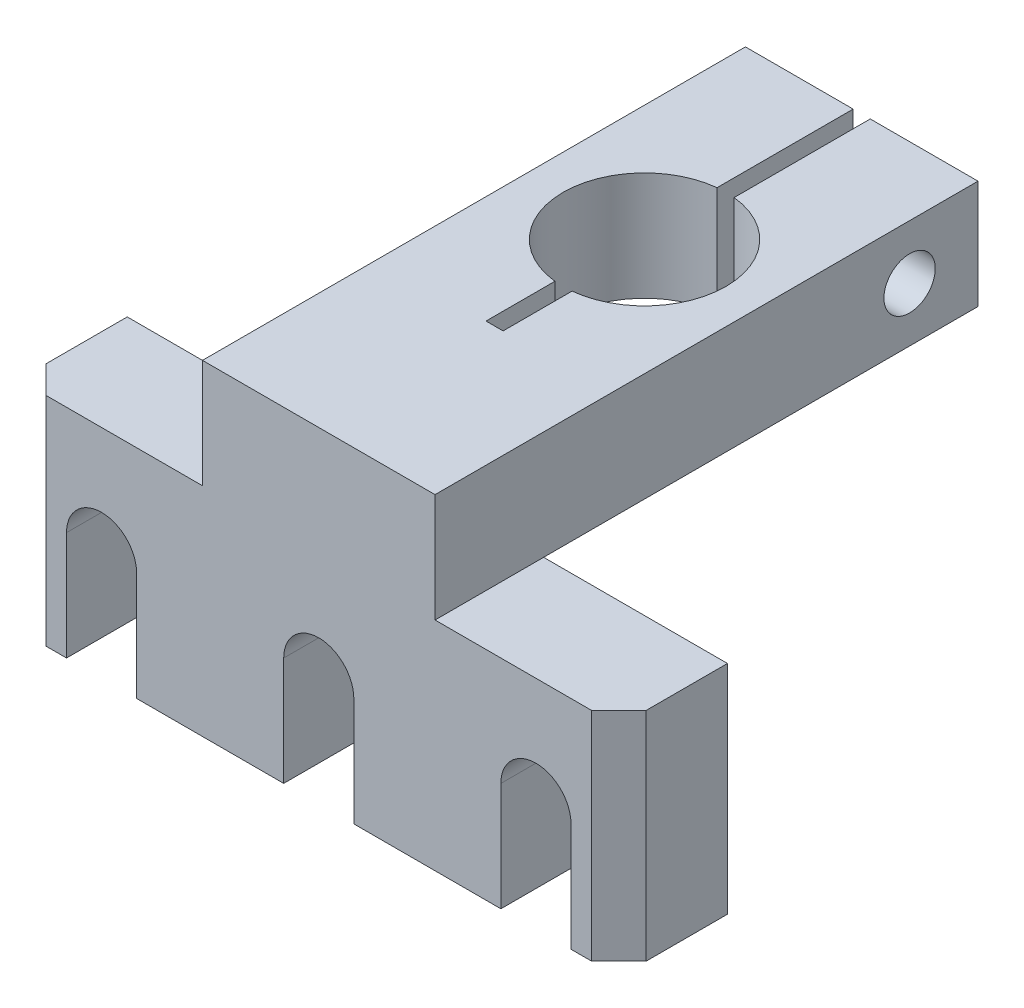
ISO-10303-21;
HEADER;
FILE_DESCRIPTION(('STEP AP214'),'2;1');
FILE_NAME('part.step','',(''),(''),'','','');
FILE_SCHEMA(('AUTOMOTIVE_DESIGN { 1 0 10303 214 1 1 1 1 }'));
ENDSEC;
DATA;
#1=APPLICATION_CONTEXT('core data for automotive mechanical design processes');
#2=APPLICATION_PROTOCOL_DEFINITION('international standard','automotive_design',2000,#1);
#3=PRODUCT_CONTEXT('',#1,'mechanical');
#4=PRODUCT('Part','Part','',(#3));
#5=PRODUCT_RELATED_PRODUCT_CATEGORY('part','',(#4));
#6=PRODUCT_DEFINITION_FORMATION('','',#4);
#7=PRODUCT_DEFINITION_CONTEXT('part definition',#1,'design');
#8=PRODUCT_DEFINITION('design','',#6,#7);
#9=PRODUCT_DEFINITION_SHAPE('','',#8);
#10=(LENGTH_UNIT() NAMED_UNIT(*) SI_UNIT(.MILLI.,.METRE.));
#11=(NAMED_UNIT(*) PLANE_ANGLE_UNIT() SI_UNIT($,.RADIAN.));
#12=(NAMED_UNIT(*) SI_UNIT($,.STERADIAN.) SOLID_ANGLE_UNIT());
#13=UNCERTAINTY_MEASURE_WITH_UNIT(LENGTH_MEASURE(1.E-05),#10,'distance_accuracy_value','');
#14=(GEOMETRIC_REPRESENTATION_CONTEXT(3) GLOBAL_UNCERTAINTY_ASSIGNED_CONTEXT((#13)) GLOBAL_UNIT_ASSIGNED_CONTEXT((#10,
#11,#12)) REPRESENTATION_CONTEXT('',''));
#15=CARTESIAN_POINT('',(0.,0.,0.));
#16=DIRECTION('',(0.,0.,1.));
#17=DIRECTION('',(1.,0.,0.));
#18=AXIS2_PLACEMENT_3D('',#15,#16,#17);
#19=CARTESIAN_POINT('',(18.05,19.050025,-3.93));
#20=DIRECTION('',(0.,0.,1.));
#21=DIRECTION('',(1.,0.,0.));
#22=AXIS2_PLACEMENT_3D('',#19,#20,#21);
#23=PLANE('',#22);
#24=DIRECTION('',(0.,1.,0.));
#25=VECTOR('',#24,1.);
#26=CARTESIAN_POINT('',(18.05,19.050025,-3.93));
#27=LINE('',#26,#25);
#28=CARTESIAN_POINT('',(18.05,19.05,-3.93));
#29=VERTEX_POINT('',#28);
#30=CARTESIAN_POINT('',(18.05,12.7,-3.93));
#31=VERTEX_POINT('',#30);
#32=EDGE_CURVE('E297',#29,#31,#27,.F.);
#33=ORIENTED_EDGE('',*,*,#32,.T.);
#34=DIRECTION('',(1.,0.,0.));
#35=VECTOR('',#34,1.);
#36=CARTESIAN_POINT('',(18.05,12.7,-3.93));
#37=LINE('',#36,#35);
#38=CARTESIAN_POINT('',(17.05,12.7,-3.93));
#39=VERTEX_POINT('',#38);
#40=EDGE_CURVE('E384',#39,#31,#37,.T.);
#41=ORIENTED_EDGE('',*,*,#40,.F.);
#42=DIRECTION('',(0.,1.,0.));
#43=VECTOR('',#42,1.);
#44=CARTESIAN_POINT('',(17.05,19.050025,-3.93));
#45=LINE('',#44,#43);
#46=CARTESIAN_POINT('',(17.05,19.05,-3.93));
#47=VERTEX_POINT('',#46);
#48=EDGE_CURVE('E291',#39,#47,#45,.T.);
#49=ORIENTED_EDGE('',*,*,#48,.T.);
#50=DIRECTION('',(1.,0.,0.));
#51=VECTOR('',#50,1.);
#52=CARTESIAN_POINT('',(18.05,19.05,-3.93));
#53=LINE('',#52,#51);
#54=EDGE_CURVE('E300',#29,#47,#53,.F.);
#55=ORIENTED_EDGE('',*,*,#54,.F.);
#56=EDGE_LOOP('',(#33,#41,#49,#55));
#57=FACE_BOUND('',#56,.T.);
#58=ADVANCED_FACE('F16',(#57),#23,.F.);
#59=CARTESIAN_POINT('',(35.100025,15.875,-21.4));
#60=DIRECTION('',(-1.,0.,0.));
#61=DIRECTION('',(0.,0.,1.));
#62=AXIS2_PLACEMENT_3D('',#59,#60,#61);
#63=CYLINDRICAL_SURFACE('',#62,1.5);
#64=CARTESIAN_POINT('',(10.75,15.875,-21.4));
#65=DIRECTION('',(-1.,0.,0.));
#66=DIRECTION('',(0.,0.,1.));
#67=AXIS2_PLACEMENT_3D('',#64,#65,#66);
#68=CIRCLE('',#67,1.5);
#69=CARTESIAN_POINT('',(10.75,15.875,-19.9));
#70=VERTEX_POINT('',#69);
#71=EDGE_CURVE('E377',#70,#70,#68,.T.);
#72=ORIENTED_EDGE('',*,*,#71,.T.);
#73=EDGE_LOOP('',(#72));
#74=FACE_BOUND('',#73,.T.);
#75=CARTESIAN_POINT('',(17.05,15.875,-21.4));
#76=DIRECTION('',(-1.,0.,0.));
#77=DIRECTION('',(0.,0.,1.));
#78=AXIS2_PLACEMENT_3D('',#75,#76,#77);
#79=CIRCLE('',#78,1.5);
#80=CARTESIAN_POINT('',(17.05,15.875,-19.9));
#81=VERTEX_POINT('',#80);
#82=EDGE_CURVE('E19',#81,#81,#79,.F.);
#83=ORIENTED_EDGE('',*,*,#82,.T.);
#84=EDGE_LOOP('',(#83));
#85=FACE_BOUND('',#84,.T.);
#86=ADVANCED_FACE('F980',(#74,#85),#63,.F.);
#87=CARTESIAN_POINT('',(17.55,19.050025,-12.7));
#88=DIRECTION('',(0.,-1.,0.));
#89=DIRECTION('',(0.,0.,-1.));
#90=AXIS2_PLACEMENT_3D('',#87,#88,#89);
#91=CYLINDRICAL_SURFACE('',#90,4.765);
#92=DIRECTION('',(0.,1.,0.));
#93=VECTOR('',#92,1.);
#94=CARTESIAN_POINT('',(18.05,19.050025,-17.4386944404551));
#95=LINE('',#94,#93);
#96=CARTESIAN_POINT('',(18.05,19.05,-17.4386944404551));
#97=VERTEX_POINT('',#96);
#98=CARTESIAN_POINT('',(18.05,12.7,-17.4386944404551));
#99=VERTEX_POINT('',#98);
#100=EDGE_CURVE('E231',#97,#99,#95,.F.);
#101=ORIENTED_EDGE('',*,*,#100,.T.);
#102=CARTESIAN_POINT('',(17.55,12.7,-12.7));
#103=DIRECTION('',(0.,-1.,0.));
#104=DIRECTION('',(0.,0.,-1.));
#105=AXIS2_PLACEMENT_3D('',#102,#103,#104);
#106=CIRCLE('',#105,4.765);
#107=CARTESIAN_POINT('',(18.05,12.7,-7.96130555954491));
#108=VERTEX_POINT('',#107);
#109=EDGE_CURVE('E222',#108,#99,#106,.F.);
#110=ORIENTED_EDGE('',*,*,#109,.F.);
#111=DIRECTION('',(0.,1.,0.));
#112=VECTOR('',#111,1.);
#113=CARTESIAN_POINT('',(18.05,19.050025,-7.96130555954491));
#114=LINE('',#113,#112);
#115=CARTESIAN_POINT('',(18.05,19.05,-7.96130555954491));
#116=VERTEX_POINT('',#115);
#117=EDGE_CURVE('E217',#108,#116,#114,.T.);
#118=ORIENTED_EDGE('',*,*,#117,.T.);
#119=CARTESIAN_POINT('',(17.55,19.05,-12.7));
#120=DIRECTION('',(0.,-1.,0.));
#121=DIRECTION('',(0.,0.,-1.));
#122=AXIS2_PLACEMENT_3D('',#119,#120,#121);
#123=CIRCLE('',#122,4.765);
#124=EDGE_CURVE('E234',#97,#116,#123,.T.);
#125=ORIENTED_EDGE('',*,*,#124,.F.);
#126=EDGE_LOOP('',(#101,#110,#118,#125));
#127=FACE_BOUND('',#126,.T.);
#128=ADVANCED_FACE('F233',(#127),#91,.F.);
#129=CARTESIAN_POINT('',(18.05,19.050025,-25.4));
#130=DIRECTION('',(1.,0.,0.));
#131=DIRECTION('',(0.,0.,-1.));
#132=AXIS2_PLACEMENT_3D('',#129,#130,#131);
#133=PLANE('',#132);
#134=ORIENTED_EDGE('',*,*,#117,.F.);
#135=DIRECTION('',(0.,0.,-1.));
#136=VECTOR('',#135,1.);
#137=CARTESIAN_POINT('',(18.05,12.7,-25.4));
#138=LINE('',#137,#136);
#139=EDGE_CURVE('E229',#31,#108,#138,.T.);
#140=ORIENTED_EDGE('',*,*,#139,.F.);
#141=ORIENTED_EDGE('',*,*,#32,.F.);
#142=DIRECTION('',(0.,0.,1.));
#143=VECTOR('',#142,1.);
#144=CARTESIAN_POINT('',(18.05,19.05,-25.4));
#145=LINE('',#144,#143);
#146=EDGE_CURVE('E422',#116,#29,#145,.T.);
#147=ORIENTED_EDGE('',*,*,#146,.F.);
#148=EDGE_LOOP('',(#134,#140,#141,#147));
#149=FACE_BOUND('',#148,.T.);
#150=ADVANCED_FACE('F964',(#149),#133,.F.);
#151=CARTESIAN_POINT('',(17.05,19.050025,-25.4));
#152=DIRECTION('',(-1.,0.,0.));
#153=DIRECTION('',(0.,0.,1.));
#154=AXIS2_PLACEMENT_3D('',#151,#152,#153);
#155=PLANE('',#154);
#156=DIRECTION('',(0.,-1.,0.));
#157=VECTOR('',#156,1.);
#158=CARTESIAN_POINT('',(17.05,19.050025,-7.9613055595449));
#159=LINE('',#158,#157);
#160=CARTESIAN_POINT('',(17.05,12.7,-7.9613055595449));
#161=VERTEX_POINT('',#160);
#162=CARTESIAN_POINT('',(17.05,19.05,-7.9613055595449));
#163=VERTEX_POINT('',#162);
#164=EDGE_CURVE('E280',#161,#163,#159,.F.);
#165=ORIENTED_EDGE('',*,*,#164,.T.);
#166=DIRECTION('',(0.,0.,1.));
#167=VECTOR('',#166,1.);
#168=CARTESIAN_POINT('',(17.05,19.05,-25.4));
#169=LINE('',#168,#167);
#170=EDGE_CURVE('E420',#47,#163,#169,.F.);
#171=ORIENTED_EDGE('',*,*,#170,.F.);
#172=ORIENTED_EDGE('',*,*,#48,.F.);
#173=DIRECTION('',(0.,0.,-1.));
#174=VECTOR('',#173,1.);
#175=CARTESIAN_POINT('',(17.05,12.7,-25.4));
#176=LINE('',#175,#174);
#177=EDGE_CURVE('E429',#161,#39,#176,.F.);
#178=ORIENTED_EDGE('',*,*,#177,.F.);
#179=EDGE_LOOP('',(#165,#171,#172,#178));
#180=FACE_BOUND('',#179,.T.);
#181=ADVANCED_FACE('F955',(#180),#155,.F.);
#182=CARTESIAN_POINT('',(17.55,19.050025,-12.7));
#183=DIRECTION('',(0.,-1.,0.));
#184=DIRECTION('',(0.,0.,-1.));
#185=AXIS2_PLACEMENT_3D('',#182,#183,#184);
#186=CYLINDRICAL_SURFACE('',#185,4.765);
#187=ORIENTED_EDGE('',*,*,#164,.F.);
#188=CARTESIAN_POINT('',(17.55,12.7,-12.7));
#189=DIRECTION('',(0.,-1.,0.));
#190=DIRECTION('',(0.,0.,-1.));
#191=AXIS2_PLACEMENT_3D('',#188,#189,#190);
#192=CIRCLE('',#191,4.765);
#193=CARTESIAN_POINT('',(17.05,12.7,-17.4386944404551));
#194=VERTEX_POINT('',#193);
#195=EDGE_CURVE('E427',#194,#161,#192,.F.);
#196=ORIENTED_EDGE('',*,*,#195,.F.);
#197=DIRECTION('',(0.,1.,0.));
#198=VECTOR('',#197,1.);
#199=CARTESIAN_POINT('',(17.05,19.050025,-17.4386944404551));
#200=LINE('',#199,#198);
#201=CARTESIAN_POINT('',(17.05,19.05,-17.4386944404551));
#202=VERTEX_POINT('',#201);
#203=EDGE_CURVE('E277',#194,#202,#200,.T.);
#204=ORIENTED_EDGE('',*,*,#203,.T.);
#205=CARTESIAN_POINT('',(17.55,19.05,-12.7));
#206=DIRECTION('',(0.,-1.,0.));
#207=DIRECTION('',(0.,0.,-1.));
#208=AXIS2_PLACEMENT_3D('',#205,#206,#207);
#209=CIRCLE('',#208,4.765);
#210=EDGE_CURVE('E418',#163,#202,#209,.T.);
#211=ORIENTED_EDGE('',*,*,#210,.F.);
#212=EDGE_LOOP('',(#187,#196,#204,#211));
#213=FACE_BOUND('',#212,.T.);
#214=ADVANCED_FACE('F946',(#213),#186,.F.);
#215=CARTESIAN_POINT('',(17.05,19.050025,-25.4));
#216=DIRECTION('',(-1.,0.,0.));
#217=DIRECTION('',(0.,0.,1.));
#218=AXIS2_PLACEMENT_3D('',#215,#216,#217);
#219=PLANE('',#218);
#220=ORIENTED_EDGE('',*,*,#82,.F.);
#221=EDGE_LOOP('',(#220));
#222=FACE_BOUND('',#221,.T.);
#223=ORIENTED_EDGE('',*,*,#203,.F.);
#224=DIRECTION('',(0.,0.,-1.));
#225=VECTOR('',#224,1.);
#226=CARTESIAN_POINT('',(17.05,12.7,-25.4));
#227=LINE('',#226,#225);
#228=CARTESIAN_POINT('',(17.05,12.7,-25.4));
#229=VERTEX_POINT('',#228);
#230=EDGE_CURVE('E246',#229,#194,#227,.F.);
#231=ORIENTED_EDGE('',*,*,#230,.F.);
#232=DIRECTION('',(0.,1.,0.));
#233=VECTOR('',#232,1.);
#234=CARTESIAN_POINT('',(17.05,0.,-25.4));
#235=LINE('',#234,#233);
#236=CARTESIAN_POINT('',(17.05,19.05,-25.4));
#237=VERTEX_POINT('',#236);
#238=EDGE_CURVE('E238',#237,#229,#235,.F.);
#239=ORIENTED_EDGE('',*,*,#238,.F.);
#240=DIRECTION('',(0.,0.,1.));
#241=VECTOR('',#240,1.);
#242=CARTESIAN_POINT('',(17.05,19.05,-25.4));
#243=LINE('',#242,#241);
#244=EDGE_CURVE('E286',#202,#237,#243,.F.);
#245=ORIENTED_EDGE('',*,*,#244,.F.);
#246=EDGE_LOOP('',(#223,#231,#239,#245));
#247=FACE_BOUND('',#246,.T.);
#248=ADVANCED_FACE('F937',(#222,#247),#219,.F.);
#249=CARTESIAN_POINT('',(0.,0.,-25.4));
#250=DIRECTION('',(0.,0.,-1.));
#251=DIRECTION('',(-1.,0.,0.));
#252=AXIS2_PLACEMENT_3D('',#249,#250,#251);
#253=PLANE('',#252);
#254=DIRECTION('',(0.,1.,0.));
#255=VECTOR('',#254,1.);
#256=CARTESIAN_POINT('',(10.75,0.,-25.4));
#257=LINE('',#256,#255);
#258=CARTESIAN_POINT('',(10.75,12.7,-25.4));
#259=VERTEX_POINT('',#258);
#260=CARTESIAN_POINT('',(10.75,19.05,-25.4));
#261=VERTEX_POINT('',#260);
#262=EDGE_CURVE('E374',#259,#261,#257,.T.);
#263=ORIENTED_EDGE('',*,*,#262,.T.);
#264=DIRECTION('',(1.,0.,0.));
#265=VECTOR('',#264,1.);
#266=CARTESIAN_POINT('',(11.75,19.05,-25.4));
#267=LINE('',#266,#265);
#268=EDGE_CURVE('E284',#237,#261,#267,.F.);
#269=ORIENTED_EDGE('',*,*,#268,.F.);
#270=ORIENTED_EDGE('',*,*,#238,.T.);
#271=DIRECTION('',(1.,0.,0.));
#272=VECTOR('',#271,1.);
#273=CARTESIAN_POINT('',(11.75,12.7,-25.4));
#274=LINE('',#273,#272);
#275=EDGE_CURVE('E243',#259,#229,#274,.T.);
#276=ORIENTED_EDGE('',*,*,#275,.F.);
#277=EDGE_LOOP('',(#263,#269,#270,#276));
#278=FACE_BOUND('',#277,.T.);
#279=ADVANCED_FACE('F928',(#278),#253,.T.);
#280=CARTESIAN_POINT('',(18.05,19.050025,-25.4));
#281=DIRECTION('',(1.,0.,0.));
#282=DIRECTION('',(0.,0.,-1.));
#283=AXIS2_PLACEMENT_3D('',#280,#281,#282);
#284=PLANE('',#283);
#285=CARTESIAN_POINT('',(18.05,15.875,-21.4));
#286=DIRECTION('',(-1.,0.,0.));
#287=DIRECTION('',(0.,0.,1.));
#288=AXIS2_PLACEMENT_3D('',#285,#286,#287);
#289=CIRCLE('',#288,1.5);
#290=CARTESIAN_POINT('',(18.05,15.875,-19.9));
#291=VERTEX_POINT('',#290);
#292=EDGE_CURVE('E369',#291,#291,#289,.F.);
#293=ORIENTED_EDGE('',*,*,#292,.T.);
#294=EDGE_LOOP('',(#293));
#295=FACE_BOUND('',#294,.T.);
#296=ORIENTED_EDGE('',*,*,#100,.F.);
#297=DIRECTION('',(0.,0.,1.));
#298=VECTOR('',#297,1.);
#299=CARTESIAN_POINT('',(18.05,19.05,-25.4));
#300=LINE('',#299,#298);
#301=CARTESIAN_POINT('',(18.05,19.05,-25.4));
#302=VERTEX_POINT('',#301);
#303=EDGE_CURVE('E257',#302,#97,#300,.T.);
#304=ORIENTED_EDGE('',*,*,#303,.F.);
#305=DIRECTION('',(0.,1.,0.));
#306=VECTOR('',#305,1.);
#307=CARTESIAN_POINT('',(18.05,0.,-25.4));
#308=LINE('',#307,#306);
#309=CARTESIAN_POINT('',(18.05,12.7,-25.4));
#310=VERTEX_POINT('',#309);
#311=EDGE_CURVE('E242',#310,#302,#308,.T.);
#312=ORIENTED_EDGE('',*,*,#311,.F.);
#313=DIRECTION('',(0.,0.,-1.));
#314=VECTOR('',#313,1.);
#315=CARTESIAN_POINT('',(18.05,12.7,-25.4));
#316=LINE('',#315,#314);
#317=EDGE_CURVE('E227',#99,#310,#316,.T.);
#318=ORIENTED_EDGE('',*,*,#317,.F.);
#319=EDGE_LOOP('',(#296,#304,#312,#318));
#320=FACE_BOUND('',#319,.T.);
#321=ADVANCED_FACE('F241',(#295,#320),#284,.F.);
#322=CARTESIAN_POINT('',(11.75,12.7,-25.4));
#323=DIRECTION('',(0.,-1.,0.));
#324=DIRECTION('',(0.,0.,-1.));
#325=AXIS2_PLACEMENT_3D('',#322,#323,#324);
#326=PLANE('',#325);
#327=ORIENTED_EDGE('',*,*,#40,.T.);
#328=ORIENTED_EDGE('',*,*,#139,.T.);
#329=ORIENTED_EDGE('',*,*,#109,.T.);
#330=ORIENTED_EDGE('',*,*,#317,.T.);
#331=DIRECTION('',(-1.,0.,0.));
#332=VECTOR('',#331,1.);
#333=CARTESIAN_POINT('',(0.,12.7,-25.4));
#334=LINE('',#333,#332);
#335=CARTESIAN_POINT('',(24.35,12.7,-25.4));
#336=VERTEX_POINT('',#335);
#337=EDGE_CURVE('E262',#336,#310,#334,.T.);
#338=ORIENTED_EDGE('',*,*,#337,.F.);
#339=DIRECTION('',(0.,0.,1.));
#340=VECTOR('',#339,1.);
#341=CARTESIAN_POINT('',(24.35,12.7,0.));
#342=LINE('',#341,#340);
#343=CARTESIAN_POINT('',(24.35,12.7,0.));
#344=VERTEX_POINT('',#343);
#345=EDGE_CURVE('E274',#336,#344,#342,.T.);
#346=ORIENTED_EDGE('',*,*,#345,.T.);
#347=DIRECTION('',(-1.,0.,0.));
#348=VECTOR('',#347,1.);
#349=CARTESIAN_POINT('',(0.,12.7,0.));
#350=LINE('',#349,#348);
#351=CARTESIAN_POINT('',(10.75,12.7,0.));
#352=VERTEX_POINT('',#351);
#353=EDGE_CURVE('E313',#352,#344,#350,.F.);
#354=ORIENTED_EDGE('',*,*,#353,.F.);
#355=DIRECTION('',(0.,0.,-1.));
#356=VECTOR('',#355,1.);
#357=CARTESIAN_POINT('',(10.75,12.7,0.));
#358=LINE('',#357,#356);
#359=EDGE_CURVE('E335',#352,#259,#358,.T.);
#360=ORIENTED_EDGE('',*,*,#359,.T.);
#361=ORIENTED_EDGE('',*,*,#275,.T.);
#362=ORIENTED_EDGE('',*,*,#230,.T.);
#363=ORIENTED_EDGE('',*,*,#195,.T.);
#364=ORIENTED_EDGE('',*,*,#177,.T.);
#365=EDGE_LOOP('',(#327,#328,#329,#330,#338,#346,#354,#360,#361,#362,#363,#364));
#366=FACE_BOUND('',#365,.T.);
#367=ADVANCED_FACE('F224',(#366),#326,.T.);
#368=CARTESIAN_POINT('',(0.,0.,-25.4));
#369=DIRECTION('',(0.,0.,-1.));
#370=DIRECTION('',(-1.,0.,0.));
#371=AXIS2_PLACEMENT_3D('',#368,#369,#370);
#372=PLANE('',#371);
#373=DIRECTION('',(0.,1.,0.));
#374=VECTOR('',#373,1.);
#375=CARTESIAN_POINT('',(24.35,0.,-25.4));
#376=LINE('',#375,#374);
#377=CARTESIAN_POINT('',(24.35,19.05,-25.4));
#378=VERTEX_POINT('',#377);
#379=EDGE_CURVE('E265',#378,#336,#376,.F.);
#380=ORIENTED_EDGE('',*,*,#379,.T.);
#381=ORIENTED_EDGE('',*,*,#337,.T.);
#382=ORIENTED_EDGE('',*,*,#311,.T.);
#383=DIRECTION('',(1.,0.,0.));
#384=VECTOR('',#383,1.);
#385=CARTESIAN_POINT('',(11.75,19.05,-25.4));
#386=LINE('',#385,#384);
#387=EDGE_CURVE('E254',#378,#302,#386,.F.);
#388=ORIENTED_EDGE('',*,*,#387,.F.);
#389=EDGE_LOOP('',(#380,#381,#382,#388));
#390=FACE_BOUND('',#389,.T.);
#391=ADVANCED_FACE('F692',(#390),#372,.T.);
#392=CARTESIAN_POINT('',(35.100025,15.875,-21.4));
#393=DIRECTION('',(-1.,0.,0.));
#394=DIRECTION('',(0.,0.,1.));
#395=AXIS2_PLACEMENT_3D('',#392,#393,#394);
#396=CYLINDRICAL_SURFACE('',#395,1.5);
#397=ORIENTED_EDGE('',*,*,#292,.F.);
#398=EDGE_LOOP('',(#397));
#399=FACE_BOUND('',#398,.T.);
#400=CARTESIAN_POINT('',(24.35,15.875,-21.4));
#401=DIRECTION('',(-1.,0.,0.));
#402=DIRECTION('',(0.,0.,1.));
#403=AXIS2_PLACEMENT_3D('',#400,#401,#402);
#404=CIRCLE('',#403,1.5);
#405=CARTESIAN_POINT('',(24.35,15.875,-19.9));
#406=VERTEX_POINT('',#405);
#407=EDGE_CURVE('E268',#406,#406,#404,.F.);
#408=ORIENTED_EDGE('',*,*,#407,.T.);
#409=EDGE_LOOP('',(#408));
#410=FACE_BOUND('',#409,.T.);
#411=ADVANCED_FACE('F694',(#399,#410),#396,.F.);
#412=CARTESIAN_POINT('',(35.1,0.,6.35));
#413=DIRECTION('',(-1.,0.,0.));
#414=DIRECTION('',(0.,0.,1.));
#415=AXIS2_PLACEMENT_3D('',#412,#413,#414);
#416=PLANE('',#415);
#417=DIRECTION('',(0.,1.,0.));
#418=VECTOR('',#417,1.);
#419=CARTESIAN_POINT('',(35.1,0.,4.75));
#420=LINE('',#419,#418);
#421=CARTESIAN_POINT('',(35.1,12.7,4.75));
#422=VERTEX_POINT('',#421);
#423=CARTESIAN_POINT('',(35.1,0.,4.75));
#424=VERTEX_POINT('',#423);
#425=EDGE_CURVE('E354',#422,#424,#420,.F.);
#426=ORIENTED_EDGE('',*,*,#425,.T.);
#427=DIRECTION('',(0.,0.,1.));
#428=VECTOR('',#427,1.);
#429=CARTESIAN_POINT('',(35.1,0.,6.35));
#430=LINE('',#429,#428);
#431=CARTESIAN_POINT('',(35.1,0.,0.));
#432=VERTEX_POINT('',#431);
#433=EDGE_CURVE('E303',#424,#432,#430,.F.);
#434=ORIENTED_EDGE('',*,*,#433,.T.);
#435=DIRECTION('',(0.,1.,0.));
#436=VECTOR('',#435,1.);
#437=CARTESIAN_POINT('',(35.1,0.,0.));
#438=LINE('',#437,#436);
#439=CARTESIAN_POINT('',(35.1,12.7,0.));
#440=VERTEX_POINT('',#439);
#441=EDGE_CURVE('E310',#440,#432,#438,.F.);
#442=ORIENTED_EDGE('',*,*,#441,.F.);
#443=DIRECTION('',(0.,0.,-1.));
#444=VECTOR('',#443,1.);
#445=CARTESIAN_POINT('',(35.1,12.7,6.35));
#446=LINE('',#445,#444);
#447=EDGE_CURVE('E316',#440,#422,#446,.F.);
#448=ORIENTED_EDGE('',*,*,#447,.T.);
#449=EDGE_LOOP('',(#426,#434,#442,#448));
#450=FACE_BOUND('',#449,.T.);
#451=ADVANCED_FACE('F701',(#450),#416,.F.);
#452=CARTESIAN_POINT('',(0.,0.,6.35));
#453=DIRECTION('',(0.,1.,0.));
#454=DIRECTION('',(0.,0.,1.));
#455=AXIS2_PLACEMENT_3D('',#452,#453,#454);
#456=PLANE('',#455);
#457=DIRECTION('',(-0.707106781186546,0.,0.707106781186549));
#458=VECTOR('',#457,1.);
#459=CARTESIAN_POINT('',(33.5,0.,6.35));
#460=LINE('',#459,#458);
#461=CARTESIAN_POINT('',(33.5,0.,6.35));
#462=VERTEX_POINT('',#461);
#463=EDGE_CURVE('E350',#424,#462,#460,.T.);
#464=ORIENTED_EDGE('',*,*,#463,.T.);
#465=DIRECTION('',(1.,0.,0.));
#466=VECTOR('',#465,1.);
#467=CARTESIAN_POINT('',(0.,0.,6.35));
#468=LINE('',#467,#466);
#469=CARTESIAN_POINT('',(32.3,0.,6.35));
#470=VERTEX_POINT('',#469);
#471=EDGE_CURVE('E307',#470,#462,#468,.T.);
#472=ORIENTED_EDGE('',*,*,#471,.F.);
#473=DIRECTION('',(0.,0.,-1.));
#474=VECTOR('',#473,1.);
#475=CARTESIAN_POINT('',(32.3,0.,6.35005));
#476=LINE('',#475,#474);
#477=CARTESIAN_POINT('',(32.3,0.,0.));
#478=VERTEX_POINT('',#477);
#479=EDGE_CURVE('E353',#470,#478,#476,.T.);
#480=ORIENTED_EDGE('',*,*,#479,.T.);
#481=DIRECTION('',(-1.,0.,0.));
#482=VECTOR('',#481,1.);
#483=CARTESIAN_POINT('',(0.,0.,0.));
#484=LINE('',#483,#482);
#485=EDGE_CURVE('E312',#432,#478,#484,.T.);
#486=ORIENTED_EDGE('',*,*,#485,.F.);
#487=ORIENTED_EDGE('',*,*,#433,.F.);
#488=EDGE_LOOP('',(#464,#472,#480,#486,#487));
#489=FACE_BOUND('',#488,.T.);
#490=ADVANCED_FACE('F657',(#489),#456,.F.);
#491=CARTESIAN_POINT('',(0.,0.,6.35));
#492=DIRECTION('',(0.,1.,0.));
#493=DIRECTION('',(0.,0.,1.));
#494=AXIS2_PLACEMENT_3D('',#491,#492,#493);
#495=PLANE('',#494);
#496=DIRECTION('',(-0.707106781186546,0.,-0.707106781186549));
#497=VECTOR('',#496,1.);
#498=CARTESIAN_POINT('',(1.6,0.,6.35));
#499=LINE('',#498,#497);
#500=CARTESIAN_POINT('',(1.6,0.,6.35));
#501=VERTEX_POINT('',#500);
#502=CARTESIAN_POINT('',(0.,0.,4.74999999999999));
#503=VERTEX_POINT('',#502);
#504=EDGE_CURVE('E338',#501,#503,#499,.T.);
#505=ORIENTED_EDGE('',*,*,#504,.T.);
#506=DIRECTION('',(0.,0.,-1.));
#507=VECTOR('',#506,1.);
#508=CARTESIAN_POINT('',(0.,0.,6.35));
#509=LINE('',#508,#507);
#510=CARTESIAN_POINT('',(0.,0.,0.));
#511=VERTEX_POINT('',#510);
#512=EDGE_CURVE('E330',#503,#511,#509,.T.);
#513=ORIENTED_EDGE('',*,*,#512,.T.);
#514=DIRECTION('',(-1.,0.,0.));
#515=VECTOR('',#514,1.);
#516=CARTESIAN_POINT('',(0.,0.,0.));
#517=LINE('',#516,#515);
#518=CARTESIAN_POINT('',(2.8,0.,0.));
#519=VERTEX_POINT('',#518);
#520=EDGE_CURVE('E482',#519,#511,#517,.T.);
#521=ORIENTED_EDGE('',*,*,#520,.F.);
#522=DIRECTION('',(0.,0.,1.));
#523=VECTOR('',#522,1.);
#524=CARTESIAN_POINT('',(2.8,0.,6.35005));
#525=LINE('',#524,#523);
#526=CARTESIAN_POINT('',(2.8,0.,6.35));
#527=VERTEX_POINT('',#526);
#528=EDGE_CURVE('E342',#519,#527,#525,.T.);
#529=ORIENTED_EDGE('',*,*,#528,.T.);
#530=DIRECTION('',(1.,0.,0.));
#531=VECTOR('',#530,1.);
#532=CARTESIAN_POINT('',(0.,0.,6.35));
#533=LINE('',#532,#531);
#534=EDGE_CURVE('E306',#501,#527,#533,.T.);
#535=ORIENTED_EDGE('',*,*,#534,.F.);
#536=EDGE_LOOP('',(#505,#513,#521,#529,#535));
#537=FACE_BOUND('',#536,.T.);
#538=ADVANCED_FACE('F685',(#537),#495,.F.);
#539=CARTESIAN_POINT('',(0.,0.,0.));
#540=DIRECTION('',(0.,0.,-1.));
#541=DIRECTION('',(-1.,0.,0.));
#542=AXIS2_PLACEMENT_3D('',#539,#540,#541);
#543=PLANE('',#542);
#544=DIRECTION('',(0.,1.,0.));
#545=VECTOR('',#544,1.);
#546=CARTESIAN_POINT('',(32.3,6.35,0.));
#547=LINE('',#546,#545);
#548=CARTESIAN_POINT('',(32.3,6.35,0.));
#549=VERTEX_POINT('',#548);
#550=EDGE_CURVE('E450',#478,#549,#547,.T.);
#551=ORIENTED_EDGE('',*,*,#550,.T.);
#552=CARTESIAN_POINT('',(30.25,6.35,0.));
#553=DIRECTION('',(0.,0.,-1.));
#554=DIRECTION('',(-1.,0.,0.));
#555=AXIS2_PLACEMENT_3D('',#552,#553,#554);
#556=CIRCLE('',#555,2.05);
#557=CARTESIAN_POINT('',(28.2,6.35,0.));
#558=VERTEX_POINT('',#557);
#559=EDGE_CURVE('E412',#549,#558,#556,.F.);
#560=ORIENTED_EDGE('',*,*,#559,.T.);
#561=DIRECTION('',(0.,-1.,0.));
#562=VECTOR('',#561,1.);
#563=CARTESIAN_POINT('',(28.2,6.35,0.));
#564=LINE('',#563,#562);
#565=CARTESIAN_POINT('',(28.2,0.,0.));
#566=VERTEX_POINT('',#565);
#567=EDGE_CURVE('E454',#558,#566,#564,.T.);
#568=ORIENTED_EDGE('',*,*,#567,.T.);
#569=DIRECTION('',(1.,0.,0.));
#570=VECTOR('',#569,1.);
#571=CARTESIAN_POINT('',(0.,0.,0.));
#572=LINE('',#571,#570);
#573=CARTESIAN_POINT('',(19.6,0.,0.));
#574=VERTEX_POINT('',#573);
#575=EDGE_CURVE('E459',#566,#574,#572,.F.);
#576=ORIENTED_EDGE('',*,*,#575,.T.);
#577=DIRECTION('',(0.,1.,0.));
#578=VECTOR('',#577,1.);
#579=CARTESIAN_POINT('',(19.6,6.35,0.));
#580=LINE('',#579,#578);
#581=CARTESIAN_POINT('',(19.6,6.35,0.));
#582=VERTEX_POINT('',#581);
#583=EDGE_CURVE('E464',#574,#582,#580,.T.);
#584=ORIENTED_EDGE('',*,*,#583,.T.);
#585=CARTESIAN_POINT('',(17.55,6.35,0.));
#586=DIRECTION('',(0.,0.,-1.));
#587=DIRECTION('',(-1.,0.,0.));
#588=AXIS2_PLACEMENT_3D('',#585,#586,#587);
#589=CIRCLE('',#588,2.05);
#590=CARTESIAN_POINT('',(15.5,6.35,0.));
#591=VERTEX_POINT('',#590);
#592=EDGE_CURVE('E408',#582,#591,#589,.F.);
#593=ORIENTED_EDGE('',*,*,#592,.T.);
#594=DIRECTION('',(0.,1.,0.));
#595=VECTOR('',#594,1.);
#596=CARTESIAN_POINT('',(15.5,0.,0.));
#597=LINE('',#596,#595);
#598=CARTESIAN_POINT('',(15.5,0.,0.));
#599=VERTEX_POINT('',#598);
#600=EDGE_CURVE('E468',#591,#599,#597,.F.);
#601=ORIENTED_EDGE('',*,*,#600,.T.);
#602=DIRECTION('',(1.,0.,0.));
#603=VECTOR('',#602,1.);
#604=CARTESIAN_POINT('',(0.,0.,0.));
#605=LINE('',#604,#603);
#606=CARTESIAN_POINT('',(6.9,0.,0.));
#607=VERTEX_POINT('',#606);
#608=EDGE_CURVE('E473',#599,#607,#605,.F.);
#609=ORIENTED_EDGE('',*,*,#608,.T.);
#610=DIRECTION('',(0.,1.,0.));
#611=VECTOR('',#610,1.);
#612=CARTESIAN_POINT('',(6.9,6.35,0.));
#613=LINE('',#612,#611);
#614=CARTESIAN_POINT('',(6.9,6.35,0.));
#615=VERTEX_POINT('',#614);
#616=EDGE_CURVE('E478',#607,#615,#613,.T.);
#617=ORIENTED_EDGE('',*,*,#616,.T.);
#618=CARTESIAN_POINT('',(4.85,6.35,0.));
#619=DIRECTION('',(0.,0.,-1.));
#620=DIRECTION('',(-1.,0.,0.));
#621=AXIS2_PLACEMENT_3D('',#618,#619,#620);
#622=CIRCLE('',#621,2.05);
#623=CARTESIAN_POINT('',(2.8,6.35,0.));
#624=VERTEX_POINT('',#623);
#625=EDGE_CURVE('E404',#615,#624,#622,.F.);
#626=ORIENTED_EDGE('',*,*,#625,.T.);
#627=DIRECTION('',(0.,1.,0.));
#628=VECTOR('',#627,1.);
#629=CARTESIAN_POINT('',(2.8,6.35,0.));
#630=LINE('',#629,#628);
#631=EDGE_CURVE('E486',#624,#519,#630,.F.);
#632=ORIENTED_EDGE('',*,*,#631,.T.);
#633=ORIENTED_EDGE('',*,*,#520,.T.);
#634=DIRECTION('',(0.,1.,0.));
#635=VECTOR('',#634,1.);
#636=CARTESIAN_POINT('',(0.,0.,0.));
#637=LINE('',#636,#635);
#638=CARTESIAN_POINT('',(0.,12.7,0.));
#639=VERTEX_POINT('',#638);
#640=EDGE_CURVE('E327',#511,#639,#637,.T.);
#641=ORIENTED_EDGE('',*,*,#640,.T.);
#642=DIRECTION('',(1.,0.,0.));
#643=VECTOR('',#642,1.);
#644=CARTESIAN_POINT('',(0.,12.7,0.));
#645=LINE('',#644,#643);
#646=EDGE_CURVE('E560',#639,#352,#645,.T.);
#647=ORIENTED_EDGE('',*,*,#646,.T.);
#648=ORIENTED_EDGE('',*,*,#353,.T.);
#649=DIRECTION('',(1.,0.,0.));
#650=VECTOR('',#649,1.);
#651=CARTESIAN_POINT('',(0.,12.7,0.));
#652=LINE('',#651,#650);
#653=EDGE_CURVE('E319',#344,#440,#652,.T.);
#654=ORIENTED_EDGE('',*,*,#653,.T.);
#655=ORIENTED_EDGE('',*,*,#441,.T.);
#656=ORIENTED_EDGE('',*,*,#485,.T.);
#657=EDGE_LOOP('',(#551,#560,#568,#576,#584,#593,#601,#609,#617,#626,#632,#633,#641,#647,#648,
#654,#655,#656));
#658=FACE_BOUND('',#657,.T.);
#659=ADVANCED_FACE('F688',(#658),#543,.T.);
#660=CARTESIAN_POINT('',(0.,0.,6.35));
#661=DIRECTION('',(1.,0.,0.));
#662=DIRECTION('',(0.,0.,-1.));
#663=AXIS2_PLACEMENT_3D('',#660,#661,#662);
#664=PLANE('',#663);
#665=DIRECTION('',(0.,1.,0.));
#666=VECTOR('',#665,1.);
#667=CARTESIAN_POINT('',(0.,0.,4.74999999999999));
#668=LINE('',#667,#666);
#669=CARTESIAN_POINT('',(0.,12.7,4.74999999999999));
#670=VERTEX_POINT('',#669);
#671=EDGE_CURVE('E341',#503,#670,#668,.T.);
#672=ORIENTED_EDGE('',*,*,#671,.T.);
#673=DIRECTION('',(0.,0.,-1.));
#674=VECTOR('',#673,1.);
#675=CARTESIAN_POINT('',(0.,12.7,6.35));
#676=LINE('',#675,#674);
#677=EDGE_CURVE('E567',#670,#639,#676,.T.);
#678=ORIENTED_EDGE('',*,*,#677,.T.);
#679=ORIENTED_EDGE('',*,*,#640,.F.);
#680=ORIENTED_EDGE('',*,*,#512,.F.);
#681=EDGE_LOOP('',(#672,#678,#679,#680));
#682=FACE_BOUND('',#681,.T.);
#683=ADVANCED_FACE('F690',(#682),#664,.F.);
#684=CARTESIAN_POINT('',(10.75,0.,0.));
#685=DIRECTION('',(1.,0.,0.));
#686=DIRECTION('',(0.,0.,-1.));
#687=AXIS2_PLACEMENT_3D('',#684,#685,#686);
#688=PLANE('',#687);
#689=ORIENTED_EDGE('',*,*,#71,.F.);
#690=EDGE_LOOP('',(#689));
#691=FACE_BOUND('',#690,.T.);
#692=ORIENTED_EDGE('',*,*,#359,.F.);
#693=DIRECTION('',(0.,0.,-1.));
#694=VECTOR('',#693,1.);
#695=CARTESIAN_POINT('',(10.75,12.7,6.35));
#696=LINE('',#695,#694);
#697=CARTESIAN_POINT('',(10.75,12.7,6.35));
#698=VERTEX_POINT('',#697);
#699=EDGE_CURVE('E563',#352,#698,#696,.F.);
#700=ORIENTED_EDGE('',*,*,#699,.T.);
#701=DIRECTION('',(0.,1.,0.));
#702=VECTOR('',#701,1.);
#703=CARTESIAN_POINT('',(10.75,0.,6.35));
#704=LINE('',#703,#702);
#705=CARTESIAN_POINT('',(10.75,19.05,6.35));
#706=VERTEX_POINT('',#705);
#707=EDGE_CURVE('E570',#698,#706,#704,.T.);
#708=ORIENTED_EDGE('',*,*,#707,.T.);
#709=DIRECTION('',(0.,0.,1.));
#710=VECTOR('',#709,1.);
#711=CARTESIAN_POINT('',(10.75,19.05,-25.4));
#712=LINE('',#711,#710);
#713=EDGE_CURVE('E258',#261,#706,#712,.T.);
#714=ORIENTED_EDGE('',*,*,#713,.F.);
#715=ORIENTED_EDGE('',*,*,#262,.F.);
#716=EDGE_LOOP('',(#692,#700,#708,#714,#715));
#717=FACE_BOUND('',#716,.T.);
#718=ADVANCED_FACE('F675',(#691,#717),#688,.F.);
#719=CARTESIAN_POINT('',(11.75,19.05,-25.4));
#720=DIRECTION('',(0.,1.,0.));
#721=DIRECTION('',(0.,0.,1.));
#722=AXIS2_PLACEMENT_3D('',#719,#720,#721);
#723=PLANE('',#722);
#724=ORIENTED_EDGE('',*,*,#387,.T.);
#725=ORIENTED_EDGE('',*,*,#303,.T.);
#726=ORIENTED_EDGE('',*,*,#124,.T.);
#727=ORIENTED_EDGE('',*,*,#146,.T.);
#728=ORIENTED_EDGE('',*,*,#54,.T.);
#729=ORIENTED_EDGE('',*,*,#170,.T.);
#730=ORIENTED_EDGE('',*,*,#210,.T.);
#731=ORIENTED_EDGE('',*,*,#244,.T.);
#732=ORIENTED_EDGE('',*,*,#268,.T.);
#733=ORIENTED_EDGE('',*,*,#713,.T.);
#734=DIRECTION('',(-1.,0.,0.));
#735=VECTOR('',#734,1.);
#736=CARTESIAN_POINT('',(0.,19.05,6.35));
#737=LINE('',#736,#735);
#738=CARTESIAN_POINT('',(24.35,19.05,6.35));
#739=VERTEX_POINT('',#738);
#740=EDGE_CURVE('E573',#706,#739,#737,.F.);
#741=ORIENTED_EDGE('',*,*,#740,.T.);
#742=DIRECTION('',(0.,0.,1.));
#743=VECTOR('',#742,1.);
#744=CARTESIAN_POINT('',(24.35,19.05,0.));
#745=LINE('',#744,#743);
#746=EDGE_CURVE('E269',#739,#378,#745,.F.);
#747=ORIENTED_EDGE('',*,*,#746,.T.);
#748=EDGE_LOOP('',(#724,#725,#726,#727,#728,#729,#730,#731,#732,#733,#741,#747));
#749=FACE_BOUND('',#748,.T.);
#750=ADVANCED_FACE('F672',(#749),#723,.T.);
#751=CARTESIAN_POINT('',(24.35,0.,0.));
#752=DIRECTION('',(-1.,0.,0.));
#753=DIRECTION('',(0.,0.,1.));
#754=AXIS2_PLACEMENT_3D('',#751,#752,#753);
#755=PLANE('',#754);
#756=ORIENTED_EDGE('',*,*,#407,.F.);
#757=EDGE_LOOP('',(#756));
#758=FACE_BOUND('',#757,.T.);
#759=ORIENTED_EDGE('',*,*,#746,.F.);
#760=DIRECTION('',(0.,1.,0.));
#761=VECTOR('',#760,1.);
#762=CARTESIAN_POINT('',(24.35,0.,6.35));
#763=LINE('',#762,#761);
#764=CARTESIAN_POINT('',(24.35,12.7,6.35));
#765=VERTEX_POINT('',#764);
#766=EDGE_CURVE('E576',#739,#765,#763,.F.);
#767=ORIENTED_EDGE('',*,*,#766,.T.);
#768=DIRECTION('',(0.,0.,-1.));
#769=VECTOR('',#768,1.);
#770=CARTESIAN_POINT('',(24.35,12.7,6.35));
#771=LINE('',#770,#769);
#772=EDGE_CURVE('E324',#765,#344,#771,.T.);
#773=ORIENTED_EDGE('',*,*,#772,.T.);
#774=ORIENTED_EDGE('',*,*,#345,.F.);
#775=ORIENTED_EDGE('',*,*,#379,.F.);
#776=EDGE_LOOP('',(#759,#767,#773,#774,#775));
#777=FACE_BOUND('',#776,.T.);
#778=ADVANCED_FACE('F669',(#758,#777),#755,.F.);
#779=CARTESIAN_POINT('',(0.,12.7,6.35));
#780=DIRECTION('',(0.,-1.,0.));
#781=DIRECTION('',(0.,0.,-1.));
#782=AXIS2_PLACEMENT_3D('',#779,#780,#781);
#783=PLANE('',#782);
#784=DIRECTION('',(-0.707106781186546,0.,0.707106781186549));
#785=VECTOR('',#784,1.);
#786=CARTESIAN_POINT('',(33.5,12.7,6.35));
#787=LINE('',#786,#785);
#788=CARTESIAN_POINT('',(33.5,12.7,6.35));
#789=VERTEX_POINT('',#788);
#790=EDGE_CURVE('E318',#789,#422,#787,.F.);
#791=ORIENTED_EDGE('',*,*,#790,.T.);
#792=ORIENTED_EDGE('',*,*,#447,.F.);
#793=ORIENTED_EDGE('',*,*,#653,.F.);
#794=ORIENTED_EDGE('',*,*,#772,.F.);
#795=DIRECTION('',(-1.,0.,0.));
#796=VECTOR('',#795,1.);
#797=CARTESIAN_POINT('',(0.,12.7,6.35));
#798=LINE('',#797,#796);
#799=EDGE_CURVE('E365',#765,#789,#798,.F.);
#800=ORIENTED_EDGE('',*,*,#799,.T.);
#801=EDGE_LOOP('',(#791,#792,#793,#794,#800));
#802=FACE_BOUND('',#801,.T.);
#803=ADVANCED_FACE('F664',(#802),#783,.F.);
#804=CARTESIAN_POINT('',(33.5,0.,6.35));
#805=DIRECTION('',(-0.707106781186549,0.,-0.707106781186546));
#806=DIRECTION('',(-0.707106781186546,0.,0.707106781186549));
#807=AXIS2_PLACEMENT_3D('',#804,#805,#806);
#808=PLANE('',#807);
#809=ORIENTED_EDGE('',*,*,#425,.F.);
#810=ORIENTED_EDGE('',*,*,#790,.F.);
#811=DIRECTION('',(0.,1.,0.));
#812=VECTOR('',#811,1.);
#813=CARTESIAN_POINT('',(33.5,0.,6.35));
#814=LINE('',#813,#812);
#815=EDGE_CURVE('E361',#789,#462,#814,.F.);
#816=ORIENTED_EDGE('',*,*,#815,.T.);
#817=ORIENTED_EDGE('',*,*,#463,.F.);
#818=EDGE_LOOP('',(#809,#810,#816,#817));
#819=FACE_BOUND('',#818,.T.);
#820=ADVANCED_FACE('F661',(#819),#808,.F.);
#821=CARTESIAN_POINT('',(32.3,6.35,6.35005));
#822=DIRECTION('',(1.,0.,0.));
#823=DIRECTION('',(0.,0.,-1.));
#824=AXIS2_PLACEMENT_3D('',#821,#822,#823);
#825=PLANE('',#824);
#826=ORIENTED_EDGE('',*,*,#550,.F.);
#827=ORIENTED_EDGE('',*,*,#479,.F.);
#828=DIRECTION('',(0.,1.,0.));
#829=VECTOR('',#828,1.);
#830=CARTESIAN_POINT('',(32.3,0.,6.35));
#831=LINE('',#830,#829);
#832=CARTESIAN_POINT('',(32.3,6.35,6.35));
#833=VERTEX_POINT('',#832);
#834=EDGE_CURVE('E364',#470,#833,#831,.T.);
#835=ORIENTED_EDGE('',*,*,#834,.T.);
#836=DIRECTION('',(0.,0.,-1.));
#837=VECTOR('',#836,1.);
#838=CARTESIAN_POINT('',(32.3,6.35,6.35005));
#839=LINE('',#838,#837);
#840=EDGE_CURVE('E415',#833,#549,#839,.T.);
#841=ORIENTED_EDGE('',*,*,#840,.T.);
#842=EDGE_LOOP('',(#826,#827,#835,#841));
#843=FACE_BOUND('',#842,.T.);
#844=ADVANCED_FACE('F651',(#843),#825,.F.);
#845=CARTESIAN_POINT('',(30.25,6.35,6.35005));
#846=DIRECTION('',(0.,0.,-1.));
#847=DIRECTION('',(-1.,0.,0.));
#848=AXIS2_PLACEMENT_3D('',#845,#846,#847);
#849=CYLINDRICAL_SURFACE('',#848,2.05);
#850=ORIENTED_EDGE('',*,*,#559,.F.);
#851=ORIENTED_EDGE('',*,*,#840,.F.);
#852=CARTESIAN_POINT('',(30.25,6.35,6.35));
#853=DIRECTION('',(0.,0.,-1.));
#854=DIRECTION('',(-1.,0.,0.));
#855=AXIS2_PLACEMENT_3D('',#852,#853,#854);
#856=CIRCLE('',#855,2.05);
#857=CARTESIAN_POINT('',(28.2,6.35,6.35));
#858=VERTEX_POINT('',#857);
#859=EDGE_CURVE('E400',#833,#858,#856,.F.);
#860=ORIENTED_EDGE('',*,*,#859,.T.);
#861=DIRECTION('',(0.,0.,1.));
#862=VECTOR('',#861,1.);
#863=CARTESIAN_POINT('',(28.2,6.35,6.35005));
#864=LINE('',#863,#862);
#865=EDGE_CURVE('E414',#858,#558,#864,.F.);
#866=ORIENTED_EDGE('',*,*,#865,.T.);
#867=EDGE_LOOP('',(#850,#851,#860,#866));
#868=FACE_BOUND('',#867,.T.);
#869=ADVANCED_FACE('F648',(#868),#849,.F.);
#870=CARTESIAN_POINT('',(28.2,6.35,6.35005));
#871=DIRECTION('',(-1.,0.,0.));
#872=DIRECTION('',(0.,-1.,0.));
#873=AXIS2_PLACEMENT_3D('',#870,#871,#872);
#874=PLANE('',#873);
#875=ORIENTED_EDGE('',*,*,#567,.F.);
#876=ORIENTED_EDGE('',*,*,#865,.F.);
#877=DIRECTION('',(0.,1.,0.));
#878=VECTOR('',#877,1.);
#879=CARTESIAN_POINT('',(28.2,0.,6.35));
#880=LINE('',#879,#878);
#881=CARTESIAN_POINT('',(28.2,0.,6.35));
#882=VERTEX_POINT('',#881);
#883=EDGE_CURVE('E403',#858,#882,#880,.F.);
#884=ORIENTED_EDGE('',*,*,#883,.T.);
#885=DIRECTION('',(0.,0.,1.));
#886=VECTOR('',#885,1.);
#887=CARTESIAN_POINT('',(28.2,0.,6.35));
#888=LINE('',#887,#886);
#889=EDGE_CURVE('E456',#882,#566,#888,.F.);
#890=ORIENTED_EDGE('',*,*,#889,.T.);
#891=EDGE_LOOP('',(#875,#876,#884,#890));
#892=FACE_BOUND('',#891,.T.);
#893=ADVANCED_FACE('F643',(#892),#874,.F.);
#894=CARTESIAN_POINT('',(0.,0.,6.35));
#895=DIRECTION('',(0.,1.,0.));
#896=DIRECTION('',(0.,0.,1.));
#897=AXIS2_PLACEMENT_3D('',#894,#895,#896);
#898=PLANE('',#897);
#899=ORIENTED_EDGE('',*,*,#889,.F.);
#900=DIRECTION('',(-1.,0.,0.));
#901=VECTOR('',#900,1.);
#902=CARTESIAN_POINT('',(0.,0.,6.35));
#903=LINE('',#902,#901);
#904=CARTESIAN_POINT('',(19.6,0.,6.35));
#905=VERTEX_POINT('',#904);
#906=EDGE_CURVE('E527',#882,#905,#903,.T.);
#907=ORIENTED_EDGE('',*,*,#906,.T.);
#908=DIRECTION('',(0.,0.,-1.));
#909=VECTOR('',#908,1.);
#910=CARTESIAN_POINT('',(19.6,0.,6.35005));
#911=LINE('',#910,#909);
#912=EDGE_CURVE('E461',#905,#574,#911,.T.);
#913=ORIENTED_EDGE('',*,*,#912,.T.);
#914=ORIENTED_EDGE('',*,*,#575,.F.);
#915=EDGE_LOOP('',(#899,#907,#913,#914));
#916=FACE_BOUND('',#915,.T.);
#917=ADVANCED_FACE('F639',(#916),#898,.F.);
#918=CARTESIAN_POINT('',(19.6,6.35,6.35005));
#919=DIRECTION('',(1.,0.,0.));
#920=DIRECTION('',(0.,0.,-1.));
#921=AXIS2_PLACEMENT_3D('',#918,#919,#920);
#922=PLANE('',#921);
#923=ORIENTED_EDGE('',*,*,#583,.F.);
#924=ORIENTED_EDGE('',*,*,#912,.F.);
#925=DIRECTION('',(0.,1.,0.));
#926=VECTOR('',#925,1.);
#927=CARTESIAN_POINT('',(19.6,0.,6.35));
#928=LINE('',#927,#926);
#929=CARTESIAN_POINT('',(19.6,6.35,6.35));
#930=VERTEX_POINT('',#929);
#931=EDGE_CURVE('E399',#905,#930,#928,.T.);
#932=ORIENTED_EDGE('',*,*,#931,.T.);
#933=DIRECTION('',(0.,0.,-1.));
#934=VECTOR('',#933,1.);
#935=CARTESIAN_POINT('',(19.6,6.35,6.35005));
#936=LINE('',#935,#934);
#937=EDGE_CURVE('E411',#930,#582,#936,.T.);
#938=ORIENTED_EDGE('',*,*,#937,.T.);
#939=EDGE_LOOP('',(#923,#924,#932,#938));
#940=FACE_BOUND('',#939,.T.);
#941=ADVANCED_FACE('F635',(#940),#922,.F.);
#942=CARTESIAN_POINT('',(17.55,6.35,6.35005));
#943=DIRECTION('',(0.,0.,-1.));
#944=DIRECTION('',(-1.,0.,0.));
#945=AXIS2_PLACEMENT_3D('',#942,#943,#944);
#946=CYLINDRICAL_SURFACE('',#945,2.05);
#947=ORIENTED_EDGE('',*,*,#592,.F.);
#948=ORIENTED_EDGE('',*,*,#937,.F.);
#949=CARTESIAN_POINT('',(17.55,6.35,6.35));
#950=DIRECTION('',(0.,0.,-1.));
#951=DIRECTION('',(-1.,0.,0.));
#952=AXIS2_PLACEMENT_3D('',#949,#950,#951);
#953=CIRCLE('',#952,2.05);
#954=CARTESIAN_POINT('',(15.5,6.35,6.35));
#955=VERTEX_POINT('',#954);
#956=EDGE_CURVE('E395',#930,#955,#953,.F.);
#957=ORIENTED_EDGE('',*,*,#956,.T.);
#958=DIRECTION('',(0.,0.,1.));
#959=VECTOR('',#958,1.);
#960=CARTESIAN_POINT('',(15.5,6.35,6.35005));
#961=LINE('',#960,#959);
#962=EDGE_CURVE('E410',#955,#591,#961,.F.);
#963=ORIENTED_EDGE('',*,*,#962,.T.);
#964=EDGE_LOOP('',(#947,#948,#957,#963));
#965=FACE_BOUND('',#964,.T.);
#966=ADVANCED_FACE('F632',(#965),#946,.F.);
#967=CARTESIAN_POINT('',(15.5,0.,6.35005));
#968=DIRECTION('',(-1.,0.,0.));
#969=DIRECTION('',(0.,0.,1.));
#970=AXIS2_PLACEMENT_3D('',#967,#968,#969);
#971=PLANE('',#970);
#972=ORIENTED_EDGE('',*,*,#600,.F.);
#973=ORIENTED_EDGE('',*,*,#962,.F.);
#974=DIRECTION('',(0.,1.,0.));
#975=VECTOR('',#974,1.);
#976=CARTESIAN_POINT('',(15.5,0.,6.35));
#977=LINE('',#976,#975);
#978=CARTESIAN_POINT('',(15.5,0.,6.35));
#979=VERTEX_POINT('',#978);
#980=EDGE_CURVE('E398',#955,#979,#977,.F.);
#981=ORIENTED_EDGE('',*,*,#980,.T.);
#982=DIRECTION('',(0.,0.,1.));
#983=VECTOR('',#982,1.);
#984=CARTESIAN_POINT('',(15.5,0.,6.35));
#985=LINE('',#984,#983);
#986=EDGE_CURVE('E470',#979,#599,#985,.F.);
#987=ORIENTED_EDGE('',*,*,#986,.T.);
#988=EDGE_LOOP('',(#972,#973,#981,#987));
#989=FACE_BOUND('',#988,.T.);
#990=ADVANCED_FACE('F627',(#989),#971,.F.);
#991=CARTESIAN_POINT('',(0.,0.,6.35));
#992=DIRECTION('',(0.,1.,0.));
#993=DIRECTION('',(0.,0.,1.));
#994=AXIS2_PLACEMENT_3D('',#991,#992,#993);
#995=PLANE('',#994);
#996=ORIENTED_EDGE('',*,*,#986,.F.);
#997=DIRECTION('',(-1.,0.,0.));
#998=VECTOR('',#997,1.);
#999=CARTESIAN_POINT('',(0.,0.,6.35));
#1000=LINE('',#999,#998);
#1001=CARTESIAN_POINT('',(6.9,0.,6.35));
#1002=VERTEX_POINT('',#1001);
#1003=EDGE_CURVE('E544',#979,#1002,#1000,.T.);
#1004=ORIENTED_EDGE('',*,*,#1003,.T.);
#1005=DIRECTION('',(0.,0.,1.));
#1006=VECTOR('',#1005,1.);
#1007=CARTESIAN_POINT('',(6.9,0.,6.35005));
#1008=LINE('',#1007,#1006);
#1009=EDGE_CURVE('E475',#1002,#607,#1008,.F.);
#1010=ORIENTED_EDGE('',*,*,#1009,.T.);
#1011=ORIENTED_EDGE('',*,*,#608,.F.);
#1012=EDGE_LOOP('',(#996,#1004,#1010,#1011));
#1013=FACE_BOUND('',#1012,.T.);
#1014=ADVANCED_FACE('F623',(#1013),#995,.F.);
#1015=CARTESIAN_POINT('',(6.9,6.35,6.35005));
#1016=DIRECTION('',(1.,0.,0.));
#1017=DIRECTION('',(0.,1.,0.));
#1018=AXIS2_PLACEMENT_3D('',#1015,#1016,#1017);
#1019=PLANE('',#1018);
#1020=ORIENTED_EDGE('',*,*,#616,.F.);
#1021=ORIENTED_EDGE('',*,*,#1009,.F.);
#1022=DIRECTION('',(0.,1.,0.));
#1023=VECTOR('',#1022,1.);
#1024=CARTESIAN_POINT('',(6.9,0.,6.35));
#1025=LINE('',#1024,#1023);
#1026=CARTESIAN_POINT('',(6.9,6.35,6.35));
#1027=VERTEX_POINT('',#1026);
#1028=EDGE_CURVE('E394',#1002,#1027,#1025,.T.);
#1029=ORIENTED_EDGE('',*,*,#1028,.T.);
#1030=DIRECTION('',(0.,0.,-1.));
#1031=VECTOR('',#1030,1.);
#1032=CARTESIAN_POINT('',(6.9,6.35,6.35005));
#1033=LINE('',#1032,#1031);
#1034=EDGE_CURVE('E407',#1027,#615,#1033,.T.);
#1035=ORIENTED_EDGE('',*,*,#1034,.T.);
#1036=EDGE_LOOP('',(#1020,#1021,#1029,#1035));
#1037=FACE_BOUND('',#1036,.T.);
#1038=ADVANCED_FACE('F619',(#1037),#1019,.F.);
#1039=CARTESIAN_POINT('',(4.85,6.35,6.35005));
#1040=DIRECTION('',(0.,0.,-1.));
#1041=DIRECTION('',(-1.,0.,0.));
#1042=AXIS2_PLACEMENT_3D('',#1039,#1040,#1041);
#1043=CYLINDRICAL_SURFACE('',#1042,2.05);
#1044=ORIENTED_EDGE('',*,*,#625,.F.);
#1045=ORIENTED_EDGE('',*,*,#1034,.F.);
#1046=CARTESIAN_POINT('',(4.85,6.35,6.35));
#1047=DIRECTION('',(0.,0.,-1.));
#1048=DIRECTION('',(-1.,0.,0.));
#1049=AXIS2_PLACEMENT_3D('',#1046,#1047,#1048);
#1050=CIRCLE('',#1049,2.05);
#1051=CARTESIAN_POINT('',(2.8,6.35,6.35));
#1052=VERTEX_POINT('',#1051);
#1053=EDGE_CURVE('E391',#1027,#1052,#1050,.F.);
#1054=ORIENTED_EDGE('',*,*,#1053,.T.);
#1055=DIRECTION('',(0.,0.,1.));
#1056=VECTOR('',#1055,1.);
#1057=CARTESIAN_POINT('',(2.8,6.35,6.35005));
#1058=LINE('',#1057,#1056);
#1059=EDGE_CURVE('E406',#1052,#624,#1058,.F.);
#1060=ORIENTED_EDGE('',*,*,#1059,.T.);
#1061=EDGE_LOOP('',(#1044,#1045,#1054,#1060));
#1062=FACE_BOUND('',#1061,.T.);
#1063=ADVANCED_FACE('F616',(#1062),#1043,.F.);
#1064=CARTESIAN_POINT('',(2.8,6.35,6.35005));
#1065=DIRECTION('',(-1.,0.,0.));
#1066=DIRECTION('',(0.,0.,1.));
#1067=AXIS2_PLACEMENT_3D('',#1064,#1065,#1066);
#1068=PLANE('',#1067);
#1069=ORIENTED_EDGE('',*,*,#631,.F.);
#1070=ORIENTED_EDGE('',*,*,#1059,.F.);
#1071=DIRECTION('',(0.,1.,0.));
#1072=VECTOR('',#1071,1.);
#1073=CARTESIAN_POINT('',(2.8,0.,6.35));
#1074=LINE('',#1073,#1072);
#1075=EDGE_CURVE('E347',#1052,#527,#1074,.F.);
#1076=ORIENTED_EDGE('',*,*,#1075,.T.);
#1077=ORIENTED_EDGE('',*,*,#528,.F.);
#1078=EDGE_LOOP('',(#1069,#1070,#1076,#1077));
#1079=FACE_BOUND('',#1078,.T.);
#1080=ADVANCED_FACE('F608',(#1079),#1068,.F.);
#1081=CARTESIAN_POINT('',(1.6,0.,6.35));
#1082=DIRECTION('',(0.707106781186549,0.,-0.707106781186546));
#1083=DIRECTION('',(-0.707106781186546,0.,-0.707106781186549));
#1084=AXIS2_PLACEMENT_3D('',#1081,#1082,#1083);
#1085=PLANE('',#1084);
#1086=ORIENTED_EDGE('',*,*,#671,.F.);
#1087=ORIENTED_EDGE('',*,*,#504,.F.);
#1088=DIRECTION('',(0.,1.,0.));
#1089=VECTOR('',#1088,1.);
#1090=CARTESIAN_POINT('',(1.6,0.,6.35));
#1091=LINE('',#1090,#1089);
#1092=CARTESIAN_POINT('',(1.6,12.7,6.35));
#1093=VERTEX_POINT('',#1092);
#1094=EDGE_CURVE('E25',#501,#1093,#1091,.T.);
#1095=ORIENTED_EDGE('',*,*,#1094,.T.);
#1096=DIRECTION('',(-0.707106781186546,0.,-0.70710678118655));
#1097=VECTOR('',#1096,1.);
#1098=CARTESIAN_POINT('',(1.6,12.7,6.35));
#1099=LINE('',#1098,#1097);
#1100=EDGE_CURVE('E33',#1093,#670,#1099,.T.);
#1101=ORIENTED_EDGE('',*,*,#1100,.T.);
#1102=EDGE_LOOP('',(#1086,#1087,#1095,#1101));
#1103=FACE_BOUND('',#1102,.T.);
#1104=ADVANCED_FACE('F683',(#1103),#1085,.F.);
#1105=CARTESIAN_POINT('',(0.,12.7,6.35));
#1106=DIRECTION('',(0.,-1.,0.));
#1107=DIRECTION('',(0.,0.,-1.));
#1108=AXIS2_PLACEMENT_3D('',#1105,#1106,#1107);
#1109=PLANE('',#1108);
#1110=ORIENTED_EDGE('',*,*,#1100,.F.);
#1111=DIRECTION('',(-1.,0.,0.));
#1112=VECTOR('',#1111,1.);
#1113=CARTESIAN_POINT('',(0.,12.7,6.35));
#1114=LINE('',#1113,#1112);
#1115=EDGE_CURVE('E11',#1093,#698,#1114,.F.);
#1116=ORIENTED_EDGE('',*,*,#1115,.T.);
#1117=ORIENTED_EDGE('',*,*,#699,.F.);
#1118=ORIENTED_EDGE('',*,*,#646,.F.);
#1119=ORIENTED_EDGE('',*,*,#677,.F.);
#1120=EDGE_LOOP('',(#1110,#1116,#1117,#1118,#1119));
#1121=FACE_BOUND('',#1120,.T.);
#1122=ADVANCED_FACE('F679',(#1121),#1109,.F.);
#1123=CARTESIAN_POINT('',(0.,0.,6.35));
#1124=DIRECTION('',(0.,0.,-1.));
#1125=DIRECTION('',(-1.,0.,0.));
#1126=AXIS2_PLACEMENT_3D('',#1123,#1124,#1125);
#1127=PLANE('',#1126);
#1128=ORIENTED_EDGE('',*,*,#1094,.F.);
#1129=ORIENTED_EDGE('',*,*,#534,.T.);
#1130=ORIENTED_EDGE('',*,*,#1075,.F.);
#1131=ORIENTED_EDGE('',*,*,#1053,.F.);
#1132=ORIENTED_EDGE('',*,*,#1028,.F.);
#1133=ORIENTED_EDGE('',*,*,#1003,.F.);
#1134=ORIENTED_EDGE('',*,*,#980,.F.);
#1135=ORIENTED_EDGE('',*,*,#956,.F.);
#1136=ORIENTED_EDGE('',*,*,#931,.F.);
#1137=ORIENTED_EDGE('',*,*,#906,.F.);
#1138=ORIENTED_EDGE('',*,*,#883,.F.);
#1139=ORIENTED_EDGE('',*,*,#859,.F.);
#1140=ORIENTED_EDGE('',*,*,#834,.F.);
#1141=ORIENTED_EDGE('',*,*,#471,.T.);
#1142=ORIENTED_EDGE('',*,*,#815,.F.);
#1143=ORIENTED_EDGE('',*,*,#799,.F.);
#1144=ORIENTED_EDGE('',*,*,#766,.F.);
#1145=ORIENTED_EDGE('',*,*,#740,.F.);
#1146=ORIENTED_EDGE('',*,*,#707,.F.);
#1147=ORIENTED_EDGE('',*,*,#1115,.F.);
#1148=EDGE_LOOP('',(#1128,#1129,#1130,#1131,#1132,#1133,#1134,#1135,#1136,#1137,#1138,#1139,
#1140,#1141,#1142,#1143,#1144,#1145,#1146,#1147));
#1149=FACE_BOUND('',#1148,.T.);
#1150=ADVANCED_FACE('F612',(#1149),#1127,.F.);
#1151=CLOSED_SHELL('',(#58,#86,#128,#150,#181,#214,#248,#279,#321,#367,#391,#411,#451,#490,#538,
#659,#683,#718,#750,#778,#803,#820,#844,#869,#893,#917,#941,#966,#990,#1014,#1038,#1063,#1080,
#1104,#1122,#1150));
#1152=MANIFOLD_SOLID_BREP('B1',#1151);
#1153=ADVANCED_BREP_SHAPE_REPRESENTATION('',(#18,#1152),#14);
#1154=SHAPE_DEFINITION_REPRESENTATION(#9,#1153);
ENDSEC;
END-ISO-10303-21;
